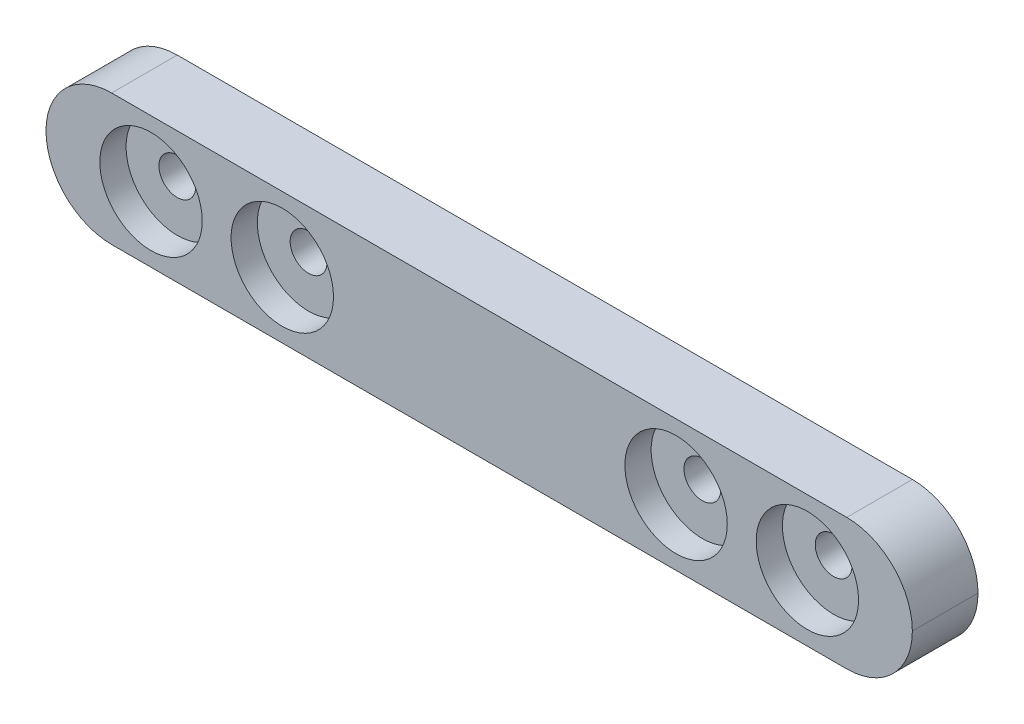
ISO-10303-21;
HEADER;
FILE_DESCRIPTION(('STEP AP214'),'2;1');
FILE_NAME('part.step','',(''),(''),'','','');
FILE_SCHEMA(('AUTOMOTIVE_DESIGN { 1 0 10303 214 1 1 1 1 }'));
ENDSEC;
DATA;
#1=APPLICATION_CONTEXT('core data for automotive mechanical design processes');
#2=APPLICATION_PROTOCOL_DEFINITION('international standard','automotive_design',2000,#1);
#3=PRODUCT_CONTEXT('',#1,'mechanical');
#4=PRODUCT('Part','Part','',(#3));
#5=PRODUCT_RELATED_PRODUCT_CATEGORY('part','',(#4));
#6=PRODUCT_DEFINITION_FORMATION('','',#4);
#7=PRODUCT_DEFINITION_CONTEXT('part definition',#1,'design');
#8=PRODUCT_DEFINITION('design','',#6,#7);
#9=PRODUCT_DEFINITION_SHAPE('','',#8);
#10=(LENGTH_UNIT() NAMED_UNIT(*) SI_UNIT(.MILLI.,.METRE.));
#11=(NAMED_UNIT(*) PLANE_ANGLE_UNIT() SI_UNIT($,.RADIAN.));
#12=(NAMED_UNIT(*) SI_UNIT($,.STERADIAN.) SOLID_ANGLE_UNIT());
#13=UNCERTAINTY_MEASURE_WITH_UNIT(LENGTH_MEASURE(1.E-05),#10,'distance_accuracy_value','');
#14=(GEOMETRIC_REPRESENTATION_CONTEXT(3) GLOBAL_UNCERTAINTY_ASSIGNED_CONTEXT((#13)) GLOBAL_UNIT_ASSIGNED_CONTEXT((#10,
#11,#12)) REPRESENTATION_CONTEXT('',''));
#15=CARTESIAN_POINT('',(0.,0.,0.));
#16=DIRECTION('',(0.,0.,1.));
#17=DIRECTION('',(1.,0.,0.));
#18=AXIS2_PLACEMENT_3D('',#15,#16,#17);
#19=CARTESIAN_POINT('',(-15.,5.,26.));
#20=DIRECTION('',(0.,0.,1.));
#21=DIRECTION('',(1.,0.,0.));
#22=AXIS2_PLACEMENT_3D('',#19,#20,#21);
#23=CYLINDRICAL_SURFACE('',#22,1.4);
#24=CARTESIAN_POINT('',(-15.,5.,31.));
#25=DIRECTION('',(0.,0.,1.));
#26=DIRECTION('',(1.,0.,0.));
#27=AXIS2_PLACEMENT_3D('',#24,#25,#26);
#28=CIRCLE('',#27,1.4);
#29=CARTESIAN_POINT('',(-13.6,5.,31.));
#30=VERTEX_POINT('',#29);
#31=EDGE_CURVE('E150',#30,#30,#28,.F.);
#32=ORIENTED_EDGE('',*,*,#31,.T.);
#33=EDGE_LOOP('',(#32));
#34=FACE_BOUND('',#33,.T.);
#35=CARTESIAN_POINT('',(-15.,5.,34.));
#36=DIRECTION('',(0.,0.,1.));
#37=DIRECTION('',(1.,0.,0.));
#38=AXIS2_PLACEMENT_3D('',#35,#36,#37);
#39=CIRCLE('',#38,1.4);
#40=CARTESIAN_POINT('',(-13.6,5.,34.));
#41=VERTEX_POINT('',#40);
#42=EDGE_CURVE('E357',#41,#41,#39,.T.);
#43=ORIENTED_EDGE('',*,*,#42,.T.);
#44=EDGE_LOOP('',(#43));
#45=FACE_BOUND('',#44,.T.);
#46=ADVANCED_FACE('F40',(#34,#45),#23,.F.);
#47=CARTESIAN_POINT('',(15.,5.,26.));
#48=DIRECTION('',(0.,0.,1.));
#49=DIRECTION('',(1.,0.,0.));
#50=AXIS2_PLACEMENT_3D('',#47,#48,#49);
#51=CYLINDRICAL_SURFACE('',#50,1.4);
#52=CARTESIAN_POINT('',(15.,5.,31.));
#53=DIRECTION('',(0.,0.,1.));
#54=DIRECTION('',(1.,0.,0.));
#55=AXIS2_PLACEMENT_3D('',#52,#53,#54);
#56=CIRCLE('',#55,1.4);
#57=CARTESIAN_POINT('',(16.4,5.,31.));
#58=VERTEX_POINT('',#57);
#59=EDGE_CURVE('E164',#58,#58,#56,.F.);
#60=ORIENTED_EDGE('',*,*,#59,.T.);
#61=EDGE_LOOP('',(#60));
#62=FACE_BOUND('',#61,.T.);
#63=CARTESIAN_POINT('',(15.,5.,34.));
#64=DIRECTION('',(0.,0.,1.));
#65=DIRECTION('',(1.,0.,0.));
#66=AXIS2_PLACEMENT_3D('',#63,#64,#65);
#67=CIRCLE('',#66,1.4);
#68=CARTESIAN_POINT('',(16.4,5.,34.));
#69=VERTEX_POINT('',#68);
#70=EDGE_CURVE('E372',#69,#69,#67,.T.);
#71=ORIENTED_EDGE('',*,*,#70,.T.);
#72=EDGE_LOOP('',(#71));
#73=FACE_BOUND('',#72,.T.);
#74=ADVANCED_FACE('F186',(#62,#73),#51,.F.);
#75=CARTESIAN_POINT('',(-25.,5.,26.));
#76=DIRECTION('',(0.,0.,1.));
#77=DIRECTION('',(1.,0.,0.));
#78=AXIS2_PLACEMENT_3D('',#75,#76,#77);
#79=CYLINDRICAL_SURFACE('',#78,1.4);
#80=CARTESIAN_POINT('',(-25.,5.,31.));
#81=DIRECTION('',(0.,0.,1.));
#82=DIRECTION('',(1.,0.,0.));
#83=AXIS2_PLACEMENT_3D('',#80,#81,#82);
#84=CIRCLE('',#83,1.4);
#85=CARTESIAN_POINT('',(-23.6,5.,31.));
#86=VERTEX_POINT('',#85);
#87=EDGE_CURVE('E156',#86,#86,#84,.F.);
#88=ORIENTED_EDGE('',*,*,#87,.T.);
#89=EDGE_LOOP('',(#88));
#90=FACE_BOUND('',#89,.T.);
#91=CARTESIAN_POINT('',(-25.,5.,34.));
#92=DIRECTION('',(0.,0.,1.));
#93=DIRECTION('',(1.,0.,0.));
#94=AXIS2_PLACEMENT_3D('',#91,#92,#93);
#95=CIRCLE('',#94,1.4);
#96=CARTESIAN_POINT('',(-23.6,5.,34.));
#97=VERTEX_POINT('',#96);
#98=EDGE_CURVE('E361',#97,#97,#95,.T.);
#99=ORIENTED_EDGE('',*,*,#98,.T.);
#100=EDGE_LOOP('',(#99));
#101=FACE_BOUND('',#100,.T.);
#102=ADVANCED_FACE('F191',(#90,#101),#79,.F.);
#103=CARTESIAN_POINT('',(25.,5.,26.));
#104=DIRECTION('',(0.,0.,1.));
#105=DIRECTION('',(1.,0.,0.));
#106=AXIS2_PLACEMENT_3D('',#103,#104,#105);
#107=CYLINDRICAL_SURFACE('',#106,1.4);
#108=CARTESIAN_POINT('',(25.,5.,31.));
#109=DIRECTION('',(0.,0.,1.));
#110=DIRECTION('',(1.,0.,0.));
#111=AXIS2_PLACEMENT_3D('',#108,#109,#110);
#112=CIRCLE('',#111,1.4);
#113=CARTESIAN_POINT('',(26.4,5.,31.));
#114=VERTEX_POINT('',#113);
#115=EDGE_CURVE('E153',#114,#114,#112,.F.);
#116=ORIENTED_EDGE('',*,*,#115,.T.);
#117=EDGE_LOOP('',(#116));
#118=FACE_BOUND('',#117,.T.);
#119=CARTESIAN_POINT('',(25.,5.,34.));
#120=DIRECTION('',(0.,0.,1.));
#121=DIRECTION('',(1.,0.,0.));
#122=AXIS2_PLACEMENT_3D('',#119,#120,#121);
#123=CIRCLE('',#122,1.4);
#124=CARTESIAN_POINT('',(26.4,5.,34.));
#125=VERTEX_POINT('',#124);
#126=EDGE_CURVE('E382',#125,#125,#123,.T.);
#127=ORIENTED_EDGE('',*,*,#126,.T.);
#128=EDGE_LOOP('',(#127));
#129=FACE_BOUND('',#128,.T.);
#130=ADVANCED_FACE('F195',(#118,#129),#107,.F.);
#131=CARTESIAN_POINT('',(-33.,10.,36.));
#132=DIRECTION('',(0.,0.,-1.));
#133=DIRECTION('',(-1.,0.,0.));
#134=AXIS2_PLACEMENT_3D('',#131,#132,#133);
#135=PLANE('',#134);
#136=CARTESIAN_POINT('',(-25.,5.,36.));
#137=DIRECTION('',(0.,0.,1.));
#138=DIRECTION('',(1.,0.,0.));
#139=AXIS2_PLACEMENT_3D('',#136,#137,#138);
#140=CIRCLE('',#139,3.90000000000001);
#141=CARTESIAN_POINT('',(-21.1,5.,36.));
#142=VERTEX_POINT('',#141);
#143=EDGE_CURVE('E365',#142,#142,#140,.T.);
#144=ORIENTED_EDGE('',*,*,#143,.F.);
#145=EDGE_LOOP('',(#144));
#146=FACE_BOUND('',#145,.T.);
#147=CARTESIAN_POINT('',(-15.,5.,36.));
#148=DIRECTION('',(0.,0.,1.));
#149=DIRECTION('',(1.,0.,0.));
#150=AXIS2_PLACEMENT_3D('',#147,#148,#149);
#151=CIRCLE('',#150,3.9);
#152=CARTESIAN_POINT('',(-11.1,5.,36.));
#153=VERTEX_POINT('',#152);
#154=EDGE_CURVE('E362',#153,#153,#151,.T.);
#155=ORIENTED_EDGE('',*,*,#154,.F.);
#156=EDGE_LOOP('',(#155));
#157=FACE_BOUND('',#156,.T.);
#158=CARTESIAN_POINT('',(15.,5.,36.));
#159=DIRECTION('',(0.,0.,1.));
#160=DIRECTION('',(1.,0.,0.));
#161=AXIS2_PLACEMENT_3D('',#158,#159,#160);
#162=CIRCLE('',#161,3.9);
#163=CARTESIAN_POINT('',(18.9,5.,36.));
#164=VERTEX_POINT('',#163);
#165=EDGE_CURVE('E375',#164,#164,#162,.T.);
#166=ORIENTED_EDGE('',*,*,#165,.F.);
#167=EDGE_LOOP('',(#166));
#168=FACE_BOUND('',#167,.T.);
#169=CARTESIAN_POINT('',(25.,5.,36.));
#170=DIRECTION('',(0.,0.,1.));
#171=DIRECTION('',(1.,0.,0.));
#172=AXIS2_PLACEMENT_3D('',#169,#170,#171);
#173=CIRCLE('',#172,3.90000000000001);
#174=CARTESIAN_POINT('',(28.9,5.,36.));
#175=VERTEX_POINT('',#174);
#176=EDGE_CURVE('E160',#175,#175,#173,.T.);
#177=ORIENTED_EDGE('',*,*,#176,.F.);
#178=EDGE_LOOP('',(#177));
#179=FACE_BOUND('',#178,.T.);
#180=DIRECTION('',(1.,0.,0.));
#181=VECTOR('',#180,1.);
#182=CARTESIAN_POINT('',(-33.,0.,36.));
#183=LINE('',#182,#181);
#184=CARTESIAN_POINT('',(-28.,0.,36.));
#185=VERTEX_POINT('',#184);
#186=CARTESIAN_POINT('',(28.,0.,36.));
#187=VERTEX_POINT('',#186);
#188=EDGE_CURVE('E138',#185,#187,#183,.T.);
#189=ORIENTED_EDGE('',*,*,#188,.T.);
#190=CARTESIAN_POINT('',(28.,5.,36.));
#191=DIRECTION('',(0.,0.,-1.));
#192=DIRECTION('',(-1.,0.,0.));
#193=AXIS2_PLACEMENT_3D('',#190,#191,#192);
#194=CIRCLE('',#193,5.);
#195=CARTESIAN_POINT('',(33.,5.,36.));
#196=VERTEX_POINT('',#195);
#197=EDGE_CURVE('E127',#187,#196,#194,.F.);
#198=ORIENTED_EDGE('',*,*,#197,.T.);
#199=CARTESIAN_POINT('',(28.,5.,36.));
#200=DIRECTION('',(0.,0.,-1.));
#201=DIRECTION('',(-1.,0.,0.));
#202=AXIS2_PLACEMENT_3D('',#199,#200,#201);
#203=CIRCLE('',#202,5.);
#204=CARTESIAN_POINT('',(28.,10.,36.));
#205=VERTEX_POINT('',#204);
#206=EDGE_CURVE('E63',#196,#205,#203,.F.);
#207=ORIENTED_EDGE('',*,*,#206,.T.);
#208=DIRECTION('',(1.,0.,0.));
#209=VECTOR('',#208,1.);
#210=CARTESIAN_POINT('',(-33.,10.,36.));
#211=LINE('',#210,#209);
#212=CARTESIAN_POINT('',(-28.,10.,36.));
#213=VERTEX_POINT('',#212);
#214=EDGE_CURVE('E132',#213,#205,#211,.T.);
#215=ORIENTED_EDGE('',*,*,#214,.F.);
#216=CARTESIAN_POINT('',(-28.,5.,36.));
#217=DIRECTION('',(0.,0.,-1.));
#218=DIRECTION('',(-1.,0.,0.));
#219=AXIS2_PLACEMENT_3D('',#216,#217,#218);
#220=CIRCLE('',#219,5.);
#221=CARTESIAN_POINT('',(-33.,5.,36.));
#222=VERTEX_POINT('',#221);
#223=EDGE_CURVE('E57',#213,#222,#220,.F.);
#224=ORIENTED_EDGE('',*,*,#223,.T.);
#225=CARTESIAN_POINT('',(-28.,5.,36.));
#226=DIRECTION('',(0.,0.,-1.));
#227=DIRECTION('',(-1.,0.,0.));
#228=AXIS2_PLACEMENT_3D('',#225,#226,#227);
#229=CIRCLE('',#228,5.);
#230=EDGE_CURVE('E124',#222,#185,#229,.F.);
#231=ORIENTED_EDGE('',*,*,#230,.T.);
#232=EDGE_LOOP('',(#189,#198,#207,#215,#224,#231));
#233=FACE_BOUND('',#232,.T.);
#234=ADVANCED_FACE('F136',(#146,#157,#168,#179,#233),#135,.F.);
#235=CARTESIAN_POINT('',(0.,10.,0.));
#236=DIRECTION('',(0.,-1.,0.));
#237=DIRECTION('',(0.,0.,-1.));
#238=AXIS2_PLACEMENT_3D('',#235,#236,#237);
#239=PLANE('',#238);
#240=ORIENTED_EDGE('',*,*,#214,.T.);
#241=DIRECTION('',(0.,0.,-1.));
#242=VECTOR('',#241,1.);
#243=CARTESIAN_POINT('',(28.,10.,0.));
#244=LINE('',#243,#242);
#245=CARTESIAN_POINT('',(28.,10.,31.));
#246=VERTEX_POINT('',#245);
#247=EDGE_CURVE('E11',#205,#246,#244,.T.);
#248=ORIENTED_EDGE('',*,*,#247,.T.);
#249=DIRECTION('',(-1.,0.,0.));
#250=VECTOR('',#249,1.);
#251=CARTESIAN_POINT('',(0.,10.,31.));
#252=LINE('',#251,#250);
#253=CARTESIAN_POINT('',(-28.,10.,31.));
#254=VERTEX_POINT('',#253);
#255=EDGE_CURVE('E102',#246,#254,#252,.T.);
#256=ORIENTED_EDGE('',*,*,#255,.T.);
#257=DIRECTION('',(0.,0.,1.));
#258=VECTOR('',#257,1.);
#259=CARTESIAN_POINT('',(-28.,10.,0.));
#260=LINE('',#259,#258);
#261=EDGE_CURVE('E49',#254,#213,#260,.T.);
#262=ORIENTED_EDGE('',*,*,#261,.T.);
#263=EDGE_LOOP('',(#240,#248,#256,#262));
#264=FACE_BOUND('',#263,.T.);
#265=ADVANCED_FACE('F131',(#264),#239,.F.);
#266=CARTESIAN_POINT('',(0.,0.,0.));
#267=DIRECTION('',(0.,-1.,0.));
#268=DIRECTION('',(0.,0.,-1.));
#269=AXIS2_PLACEMENT_3D('',#266,#267,#268);
#270=PLANE('',#269);
#271=DIRECTION('',(1.,0.,0.));
#272=VECTOR('',#271,1.);
#273=CARTESIAN_POINT('',(-33.,0.,31.));
#274=LINE('',#273,#272);
#275=CARTESIAN_POINT('',(-28.,0.,31.));
#276=VERTEX_POINT('',#275);
#277=CARTESIAN_POINT('',(28.,0.,31.));
#278=VERTEX_POINT('',#277);
#279=EDGE_CURVE('E111',#276,#278,#274,.T.);
#280=ORIENTED_EDGE('',*,*,#279,.T.);
#281=DIRECTION('',(0.,0.,-1.));
#282=VECTOR('',#281,1.);
#283=CARTESIAN_POINT('',(28.,0.,36.));
#284=LINE('',#283,#282);
#285=EDGE_CURVE('E115',#278,#187,#284,.F.);
#286=ORIENTED_EDGE('',*,*,#285,.T.);
#287=ORIENTED_EDGE('',*,*,#188,.F.);
#288=DIRECTION('',(0.,0.,1.));
#289=VECTOR('',#288,1.);
#290=CARTESIAN_POINT('',(-28.,0.,31.));
#291=LINE('',#290,#289);
#292=EDGE_CURVE('E116',#185,#276,#291,.F.);
#293=ORIENTED_EDGE('',*,*,#292,.T.);
#294=EDGE_LOOP('',(#280,#286,#287,#293));
#295=FACE_BOUND('',#294,.T.);
#296=ADVANCED_FACE('F148',(#295),#270,.T.);
#297=CARTESIAN_POINT('',(-33.,0.,31.));
#298=DIRECTION('',(0.,0.,1.));
#299=DIRECTION('',(1.,0.,0.));
#300=AXIS2_PLACEMENT_3D('',#297,#298,#299);
#301=PLANE('',#300);
#302=ORIENTED_EDGE('',*,*,#59,.F.);
#303=EDGE_LOOP('',(#302));
#304=FACE_BOUND('',#303,.T.);
#305=ORIENTED_EDGE('',*,*,#115,.F.);
#306=EDGE_LOOP('',(#305));
#307=FACE_BOUND('',#306,.T.);
#308=ORIENTED_EDGE('',*,*,#87,.F.);
#309=EDGE_LOOP('',(#308));
#310=FACE_BOUND('',#309,.T.);
#311=ORIENTED_EDGE('',*,*,#31,.F.);
#312=EDGE_LOOP('',(#311));
#313=FACE_BOUND('',#312,.T.);
#314=CARTESIAN_POINT('',(28.,5.,31.));
#315=DIRECTION('',(0.,0.,1.));
#316=DIRECTION('',(1.,0.,0.));
#317=AXIS2_PLACEMENT_3D('',#314,#315,#316);
#318=CIRCLE('',#317,5.);
#319=CARTESIAN_POINT('',(33.,5.,31.));
#320=VERTEX_POINT('',#319);
#321=EDGE_CURVE('E94',#246,#320,#318,.F.);
#322=ORIENTED_EDGE('',*,*,#321,.T.);
#323=CARTESIAN_POINT('',(28.,5.,31.));
#324=DIRECTION('',(0.,0.,1.));
#325=DIRECTION('',(1.,0.,0.));
#326=AXIS2_PLACEMENT_3D('',#323,#324,#325);
#327=CIRCLE('',#326,5.);
#328=EDGE_CURVE('E99',#320,#278,#327,.F.);
#329=ORIENTED_EDGE('',*,*,#328,.T.);
#330=ORIENTED_EDGE('',*,*,#279,.F.);
#331=CARTESIAN_POINT('',(-28.,5.,31.));
#332=DIRECTION('',(0.,0.,1.));
#333=DIRECTION('',(1.,0.,0.));
#334=AXIS2_PLACEMENT_3D('',#331,#332,#333);
#335=CIRCLE('',#334,5.);
#336=CARTESIAN_POINT('',(-33.,5.,31.));
#337=VERTEX_POINT('',#336);
#338=EDGE_CURVE('E105',#276,#337,#335,.F.);
#339=ORIENTED_EDGE('',*,*,#338,.T.);
#340=CARTESIAN_POINT('',(-28.,5.,31.));
#341=DIRECTION('',(0.,0.,1.));
#342=DIRECTION('',(1.,0.,0.));
#343=AXIS2_PLACEMENT_3D('',#340,#341,#342);
#344=CIRCLE('',#343,5.);
#345=EDGE_CURVE('E137',#337,#254,#344,.F.);
#346=ORIENTED_EDGE('',*,*,#345,.T.);
#347=ORIENTED_EDGE('',*,*,#255,.F.);
#348=EDGE_LOOP('',(#322,#329,#330,#339,#346,#347));
#349=FACE_BOUND('',#348,.T.);
#350=ADVANCED_FACE('F96',(#304,#307,#310,#313,#349),#301,.F.);
#351=CARTESIAN_POINT('',(28.,5.,0.));
#352=DIRECTION('',(0.,0.,-1.));
#353=DIRECTION('',(-1.,0.,0.));
#354=AXIS2_PLACEMENT_3D('',#351,#352,#353);
#355=CYLINDRICAL_SURFACE('',#354,5.);
#356=ORIENTED_EDGE('',*,*,#247,.F.);
#357=ORIENTED_EDGE('',*,*,#206,.F.);
#358=DIRECTION('',(0.,0.,-1.));
#359=VECTOR('',#358,1.);
#360=CARTESIAN_POINT('',(33.,5.,36.));
#361=LINE('',#360,#359);
#362=EDGE_CURVE('E108',#320,#196,#361,.F.);
#363=ORIENTED_EDGE('',*,*,#362,.F.);
#364=ORIENTED_EDGE('',*,*,#321,.F.);
#365=EDGE_LOOP('',(#356,#357,#363,#364));
#366=FACE_BOUND('',#365,.T.);
#367=ADVANCED_FACE('F109',(#366),#355,.T.);
#368=CARTESIAN_POINT('',(28.,5.,36.));
#369=DIRECTION('',(0.,0.,1.));
#370=DIRECTION('',(1.,0.,0.));
#371=AXIS2_PLACEMENT_3D('',#368,#369,#370);
#372=CYLINDRICAL_SURFACE('',#371,5.);
#373=ORIENTED_EDGE('',*,*,#197,.F.);
#374=ORIENTED_EDGE('',*,*,#285,.F.);
#375=ORIENTED_EDGE('',*,*,#328,.F.);
#376=ORIENTED_EDGE('',*,*,#362,.T.);
#377=EDGE_LOOP('',(#373,#374,#375,#376));
#378=FACE_BOUND('',#377,.T.);
#379=ADVANCED_FACE('F113',(#378),#372,.T.);
#380=CARTESIAN_POINT('',(-28.,5.,0.));
#381=DIRECTION('',(0.,0.,1.));
#382=DIRECTION('',(1.,0.,0.));
#383=AXIS2_PLACEMENT_3D('',#380,#381,#382);
#384=CYLINDRICAL_SURFACE('',#383,5.);
#385=ORIENTED_EDGE('',*,*,#261,.F.);
#386=ORIENTED_EDGE('',*,*,#345,.F.);
#387=DIRECTION('',(0.,0.,1.));
#388=VECTOR('',#387,1.);
#389=CARTESIAN_POINT('',(-33.,5.,36.));
#390=LINE('',#389,#388);
#391=EDGE_CURVE('E44',#222,#337,#390,.F.);
#392=ORIENTED_EDGE('',*,*,#391,.F.);
#393=ORIENTED_EDGE('',*,*,#223,.F.);
#394=EDGE_LOOP('',(#385,#386,#392,#393));
#395=FACE_BOUND('',#394,.T.);
#396=ADVANCED_FACE('F42',(#395),#384,.T.);
#397=CARTESIAN_POINT('',(-28.,5.,36.));
#398=DIRECTION('',(0.,0.,-1.));
#399=DIRECTION('',(-1.,0.,0.));
#400=AXIS2_PLACEMENT_3D('',#397,#398,#399);
#401=CYLINDRICAL_SURFACE('',#400,5.);
#402=ORIENTED_EDGE('',*,*,#338,.F.);
#403=ORIENTED_EDGE('',*,*,#292,.F.);
#404=ORIENTED_EDGE('',*,*,#230,.F.);
#405=ORIENTED_EDGE('',*,*,#391,.T.);
#406=EDGE_LOOP('',(#402,#403,#404,#405));
#407=FACE_BOUND('',#406,.T.);
#408=ADVANCED_FACE('F145',(#407),#401,.T.);
#409=CARTESIAN_POINT('',(25.,5.,34.));
#410=DIRECTION('',(0.,0.,1.));
#411=DIRECTION('',(1.,0.,0.));
#412=AXIS2_PLACEMENT_3D('',#409,#410,#411);
#413=CYLINDRICAL_SURFACE('',#412,3.90000000000001);
#414=CARTESIAN_POINT('',(25.,5.,34.));
#415=DIRECTION('',(0.,0.,1.));
#416=DIRECTION('',(1.,0.,0.));
#417=AXIS2_PLACEMENT_3D('',#414,#415,#416);
#418=CIRCLE('',#417,3.90000000000001);
#419=CARTESIAN_POINT('',(28.9,5.,34.));
#420=VERTEX_POINT('',#419);
#421=EDGE_CURVE('E376',#420,#420,#418,.T.);
#422=ORIENTED_EDGE('',*,*,#421,.F.);
#423=EDGE_LOOP('',(#422));
#424=FACE_BOUND('',#423,.T.);
#425=ORIENTED_EDGE('',*,*,#176,.T.);
#426=EDGE_LOOP('',(#425));
#427=FACE_BOUND('',#426,.T.);
#428=ADVANCED_FACE('F204',(#424,#427),#413,.F.);
#429=CARTESIAN_POINT('',(25.,5.,34.));
#430=DIRECTION('',(0.,0.,1.));
#431=DIRECTION('',(1.,0.,0.));
#432=AXIS2_PLACEMENT_3D('',#429,#430,#431);
#433=PLANE('',#432);
#434=ORIENTED_EDGE('',*,*,#126,.F.);
#435=EDGE_LOOP('',(#434));
#436=FACE_BOUND('',#435,.T.);
#437=ORIENTED_EDGE('',*,*,#421,.T.);
#438=EDGE_LOOP('',(#437));
#439=FACE_BOUND('',#438,.T.);
#440=ADVANCED_FACE('F209',(#436,#439),#433,.T.);
#441=CARTESIAN_POINT('',(-25.,5.,34.));
#442=DIRECTION('',(0.,0.,1.));
#443=DIRECTION('',(1.,0.,0.));
#444=AXIS2_PLACEMENT_3D('',#441,#442,#443);
#445=CYLINDRICAL_SURFACE('',#444,3.90000000000001);
#446=CARTESIAN_POINT('',(-25.,5.,34.));
#447=DIRECTION('',(0.,0.,1.));
#448=DIRECTION('',(1.,0.,0.));
#449=AXIS2_PLACEMENT_3D('',#446,#447,#448);
#450=CIRCLE('',#449,3.90000000000001);
#451=CARTESIAN_POINT('',(-21.1,5.,34.));
#452=VERTEX_POINT('',#451);
#453=EDGE_CURVE('E143',#452,#452,#450,.T.);
#454=ORIENTED_EDGE('',*,*,#453,.F.);
#455=EDGE_LOOP('',(#454));
#456=FACE_BOUND('',#455,.T.);
#457=ORIENTED_EDGE('',*,*,#143,.T.);
#458=EDGE_LOOP('',(#457));
#459=FACE_BOUND('',#458,.T.);
#460=ADVANCED_FACE('F290',(#456,#459),#445,.F.);
#461=CARTESIAN_POINT('',(-25.,5.,34.));
#462=DIRECTION('',(0.,0.,1.));
#463=DIRECTION('',(1.,0.,0.));
#464=AXIS2_PLACEMENT_3D('',#461,#462,#463);
#465=PLANE('',#464);
#466=ORIENTED_EDGE('',*,*,#98,.F.);
#467=EDGE_LOOP('',(#466));
#468=FACE_BOUND('',#467,.T.);
#469=ORIENTED_EDGE('',*,*,#453,.T.);
#470=EDGE_LOOP('',(#469));
#471=FACE_BOUND('',#470,.T.);
#472=ADVANCED_FACE('F299',(#468,#471),#465,.T.);
#473=CARTESIAN_POINT('',(15.,5.,34.));
#474=DIRECTION('',(0.,0.,1.));
#475=DIRECTION('',(1.,0.,0.));
#476=AXIS2_PLACEMENT_3D('',#473,#474,#475);
#477=CYLINDRICAL_SURFACE('',#476,3.9);
#478=CARTESIAN_POINT('',(15.,5.,34.));
#479=DIRECTION('',(0.,0.,1.));
#480=DIRECTION('',(1.,0.,0.));
#481=AXIS2_PLACEMENT_3D('',#478,#479,#480);
#482=CIRCLE('',#481,3.9);
#483=CARTESIAN_POINT('',(18.9,5.,34.));
#484=VERTEX_POINT('',#483);
#485=EDGE_CURVE('E377',#484,#484,#482,.T.);
#486=ORIENTED_EDGE('',*,*,#485,.F.);
#487=EDGE_LOOP('',(#486));
#488=FACE_BOUND('',#487,.T.);
#489=ORIENTED_EDGE('',*,*,#165,.T.);
#490=EDGE_LOOP('',(#489));
#491=FACE_BOUND('',#490,.T.);
#492=ADVANCED_FACE('F308',(#488,#491),#477,.F.);
#493=CARTESIAN_POINT('',(15.,5.,34.));
#494=DIRECTION('',(0.,0.,1.));
#495=DIRECTION('',(1.,0.,0.));
#496=AXIS2_PLACEMENT_3D('',#493,#494,#495);
#497=PLANE('',#496);
#498=ORIENTED_EDGE('',*,*,#70,.F.);
#499=EDGE_LOOP('',(#498));
#500=FACE_BOUND('',#499,.T.);
#501=ORIENTED_EDGE('',*,*,#485,.T.);
#502=EDGE_LOOP('',(#501));
#503=FACE_BOUND('',#502,.T.);
#504=ADVANCED_FACE('F317',(#500,#503),#497,.T.);
#505=CARTESIAN_POINT('',(-15.,5.,34.));
#506=DIRECTION('',(0.,0.,1.));
#507=DIRECTION('',(1.,0.,0.));
#508=AXIS2_PLACEMENT_3D('',#505,#506,#507);
#509=CYLINDRICAL_SURFACE('',#508,3.9);
#510=CARTESIAN_POINT('',(-15.,5.,34.));
#511=DIRECTION('',(0.,0.,1.));
#512=DIRECTION('',(1.,0.,0.));
#513=AXIS2_PLACEMENT_3D('',#510,#511,#512);
#514=CIRCLE('',#513,3.9);
#515=CARTESIAN_POINT('',(-11.1,5.,34.));
#516=VERTEX_POINT('',#515);
#517=EDGE_CURVE('E360',#516,#516,#514,.T.);
#518=ORIENTED_EDGE('',*,*,#517,.F.);
#519=EDGE_LOOP('',(#518));
#520=FACE_BOUND('',#519,.T.);
#521=ORIENTED_EDGE('',*,*,#154,.T.);
#522=EDGE_LOOP('',(#521));
#523=FACE_BOUND('',#522,.T.);
#524=ADVANCED_FACE('F326',(#520,#523),#509,.F.);
#525=CARTESIAN_POINT('',(-15.,5.,34.));
#526=DIRECTION('',(0.,0.,1.));
#527=DIRECTION('',(1.,0.,0.));
#528=AXIS2_PLACEMENT_3D('',#525,#526,#527);
#529=PLANE('',#528);
#530=ORIENTED_EDGE('',*,*,#42,.F.);
#531=EDGE_LOOP('',(#530));
#532=FACE_BOUND('',#531,.T.);
#533=ORIENTED_EDGE('',*,*,#517,.T.);
#534=EDGE_LOOP('',(#533));
#535=FACE_BOUND('',#534,.T.);
#536=ADVANCED_FACE('F335',(#532,#535),#529,.T.);
#537=CLOSED_SHELL('',(#46,#74,#102,#130,#234,#265,#296,#350,#367,#379,#396,#408,#428,#440,#460,
#472,#492,#504,#524,#536));
#538=MANIFOLD_SOLID_BREP('B2',#537);
#539=ADVANCED_BREP_SHAPE_REPRESENTATION('',(#18,#538),#14);
#540=SHAPE_DEFINITION_REPRESENTATION(#9,#539);
ENDSEC;
END-ISO-10303-21;
